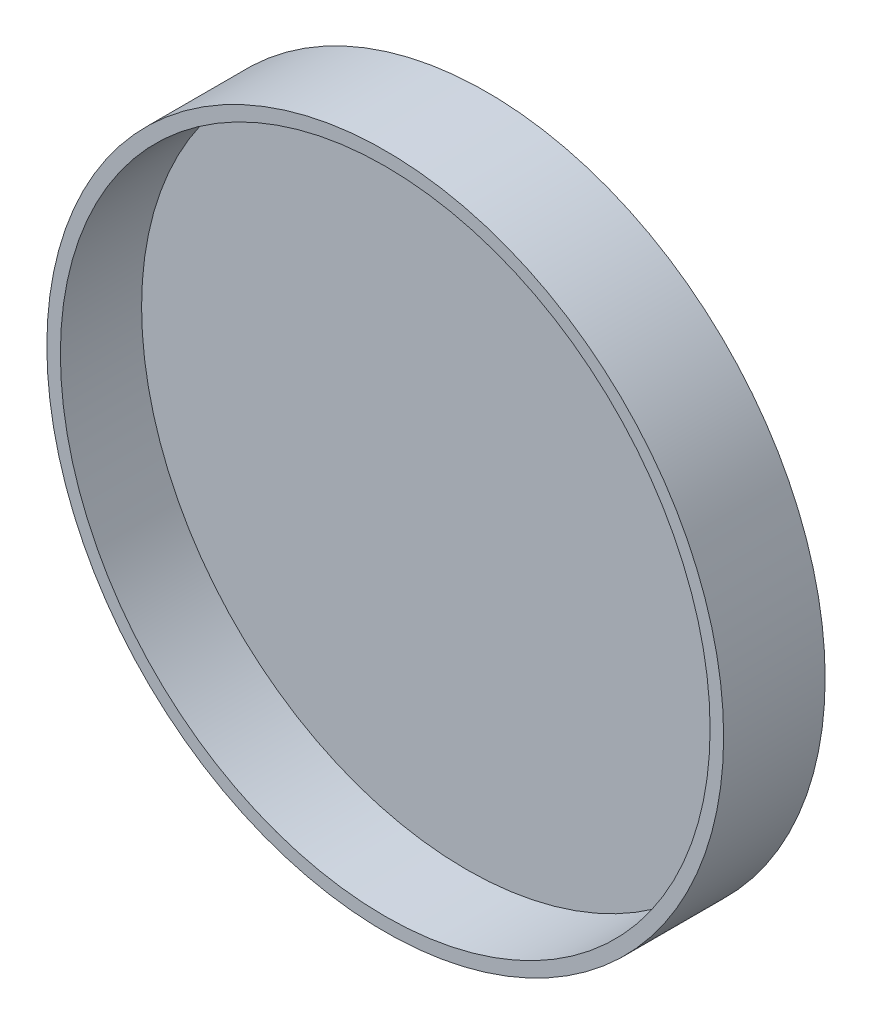
ISO-10303-21;
HEADER;
FILE_DESCRIPTION(('STEP AP214'),'2;1');
FILE_NAME('part.step','',(''),(''),'','','');
FILE_SCHEMA(('AUTOMOTIVE_DESIGN { 1 0 10303 214 1 1 1 1 }'));
ENDSEC;
DATA;
#1=APPLICATION_CONTEXT('core data for automotive mechanical design processes');
#2=APPLICATION_PROTOCOL_DEFINITION('international standard','automotive_design',2000,#1);
#3=PRODUCT_CONTEXT('',#1,'mechanical');
#4=PRODUCT('Part','Part','',(#3));
#5=PRODUCT_RELATED_PRODUCT_CATEGORY('part','',(#4));
#6=PRODUCT_DEFINITION_FORMATION('','',#4);
#7=PRODUCT_DEFINITION_CONTEXT('part definition',#1,'design');
#8=PRODUCT_DEFINITION('design','',#6,#7);
#9=PRODUCT_DEFINITION_SHAPE('','',#8);
#10=(LENGTH_UNIT() NAMED_UNIT(*) SI_UNIT(.MILLI.,.METRE.));
#11=(NAMED_UNIT(*) PLANE_ANGLE_UNIT() SI_UNIT($,.RADIAN.));
#12=(NAMED_UNIT(*) SI_UNIT($,.STERADIAN.) SOLID_ANGLE_UNIT());
#13=UNCERTAINTY_MEASURE_WITH_UNIT(LENGTH_MEASURE(1.E-05),#10,'distance_accuracy_value','');
#14=(GEOMETRIC_REPRESENTATION_CONTEXT(3) GLOBAL_UNCERTAINTY_ASSIGNED_CONTEXT((#13)) GLOBAL_UNIT_ASSIGNED_CONTEXT((#10,
#11,#12)) REPRESENTATION_CONTEXT('',''));
#15=CARTESIAN_POINT('',(0.,0.,0.));
#16=DIRECTION('',(0.,0.,1.));
#17=DIRECTION('',(1.,0.,0.));
#18=AXIS2_PLACEMENT_3D('',#15,#16,#17);
#19=CARTESIAN_POINT('',(0.,0.,15.));
#20=DIRECTION('',(0.,0.,-1.));
#21=DIRECTION('',(-1.,0.,0.));
#22=AXIS2_PLACEMENT_3D('',#19,#20,#21);
#23=CYLINDRICAL_SURFACE('',#22,50.);
#24=CARTESIAN_POINT('',(0.,0.,15.));
#25=DIRECTION('',(0.,0.,1.));
#26=DIRECTION('',(1.,0.,0.));
#27=AXIS2_PLACEMENT_3D('',#24,#25,#26);
#28=CIRCLE('',#27,50.);
#29=CARTESIAN_POINT('',(50.,0.,15.));
#30=VERTEX_POINT('',#29);
#31=EDGE_CURVE('E10',#30,#30,#28,.T.);
#32=ORIENTED_EDGE('',*,*,#31,.F.);
#33=EDGE_LOOP('',(#32));
#34=FACE_BOUND('',#33,.T.);
#35=CARTESIAN_POINT('',(0.,0.,0.));
#36=DIRECTION('',(0.,0.,1.));
#37=DIRECTION('',(1.,0.,0.));
#38=AXIS2_PLACEMENT_3D('',#35,#36,#37);
#39=CIRCLE('',#38,50.);
#40=CARTESIAN_POINT('',(50.,0.,0.));
#41=VERTEX_POINT('',#40);
#42=EDGE_CURVE('E33',#41,#41,#39,.T.);
#43=ORIENTED_EDGE('',*,*,#42,.T.);
#44=EDGE_LOOP('',(#43));
#45=FACE_BOUND('',#44,.T.);
#46=ADVANCED_FACE('F30',(#34,#45),#23,.T.);
#47=CARTESIAN_POINT('',(0.,0.,15.));
#48=DIRECTION('',(0.,0.,1.));
#49=DIRECTION('',(1.,0.,0.));
#50=AXIS2_PLACEMENT_3D('',#47,#48,#49);
#51=PLANE('',#50);
#52=CARTESIAN_POINT('',(0.,0.,15.));
#53=DIRECTION('',(0.,0.,1.));
#54=DIRECTION('',(1.,0.,0.));
#55=AXIS2_PLACEMENT_3D('',#52,#53,#54);
#56=CIRCLE('',#55,48.);
#57=CARTESIAN_POINT('',(48.,0.,15.));
#58=VERTEX_POINT('',#57);
#59=EDGE_CURVE('E42',#58,#58,#56,.T.);
#60=ORIENTED_EDGE('',*,*,#59,.F.);
#61=EDGE_LOOP('',(#60));
#62=FACE_BOUND('',#61,.T.);
#63=ORIENTED_EDGE('',*,*,#31,.T.);
#64=EDGE_LOOP('',(#63));
#65=FACE_BOUND('',#64,.T.);
#66=ADVANCED_FACE('F57',(#62,#65),#51,.T.);
#67=CARTESIAN_POINT('',(0.,0.,0.));
#68=DIRECTION('',(0.,0.,1.));
#69=DIRECTION('',(1.,0.,0.));
#70=AXIS2_PLACEMENT_3D('',#67,#68,#69);
#71=PLANE('',#70);
#72=ORIENTED_EDGE('',*,*,#42,.F.);
#73=EDGE_LOOP('',(#72));
#74=FACE_BOUND('',#73,.T.);
#75=ADVANCED_FACE('F53',(#74),#71,.F.);
#76=CARTESIAN_POINT('',(0.,0.,3.));
#77=DIRECTION('',(0.,0.,1.));
#78=DIRECTION('',(1.,0.,0.));
#79=AXIS2_PLACEMENT_3D('',#76,#77,#78);
#80=CYLINDRICAL_SURFACE('',#79,48.);
#81=CARTESIAN_POINT('',(0.,0.,3.));
#82=DIRECTION('',(0.,0.,1.));
#83=DIRECTION('',(1.,0.,0.));
#84=AXIS2_PLACEMENT_3D('',#81,#82,#83);
#85=CIRCLE('',#84,48.);
#86=CARTESIAN_POINT('',(48.,0.,3.));
#87=VERTEX_POINT('',#86);
#88=EDGE_CURVE('E40',#87,#87,#85,.T.);
#89=ORIENTED_EDGE('',*,*,#88,.F.);
#90=EDGE_LOOP('',(#89));
#91=FACE_BOUND('',#90,.T.);
#92=ORIENTED_EDGE('',*,*,#59,.T.);
#93=EDGE_LOOP('',(#92));
#94=FACE_BOUND('',#93,.T.);
#95=ADVANCED_FACE('F50',(#91,#94),#80,.F.);
#96=CARTESIAN_POINT('',(0.,0.,3.));
#97=DIRECTION('',(0.,0.,1.));
#98=DIRECTION('',(1.,0.,0.));
#99=AXIS2_PLACEMENT_3D('',#96,#97,#98);
#100=PLANE('',#99);
#101=ORIENTED_EDGE('',*,*,#88,.T.);
#102=EDGE_LOOP('',(#101));
#103=FACE_BOUND('',#102,.T.);
#104=ADVANCED_FACE('F48',(#103),#100,.T.);
#105=CLOSED_SHELL('',(#46,#66,#75,#95,#104));
#106=MANIFOLD_SOLID_BREP('B2',#105);
#107=ADVANCED_BREP_SHAPE_REPRESENTATION('',(#18,#106),#14);
#108=SHAPE_DEFINITION_REPRESENTATION(#9,#107);
ENDSEC;
END-ISO-10303-21;
